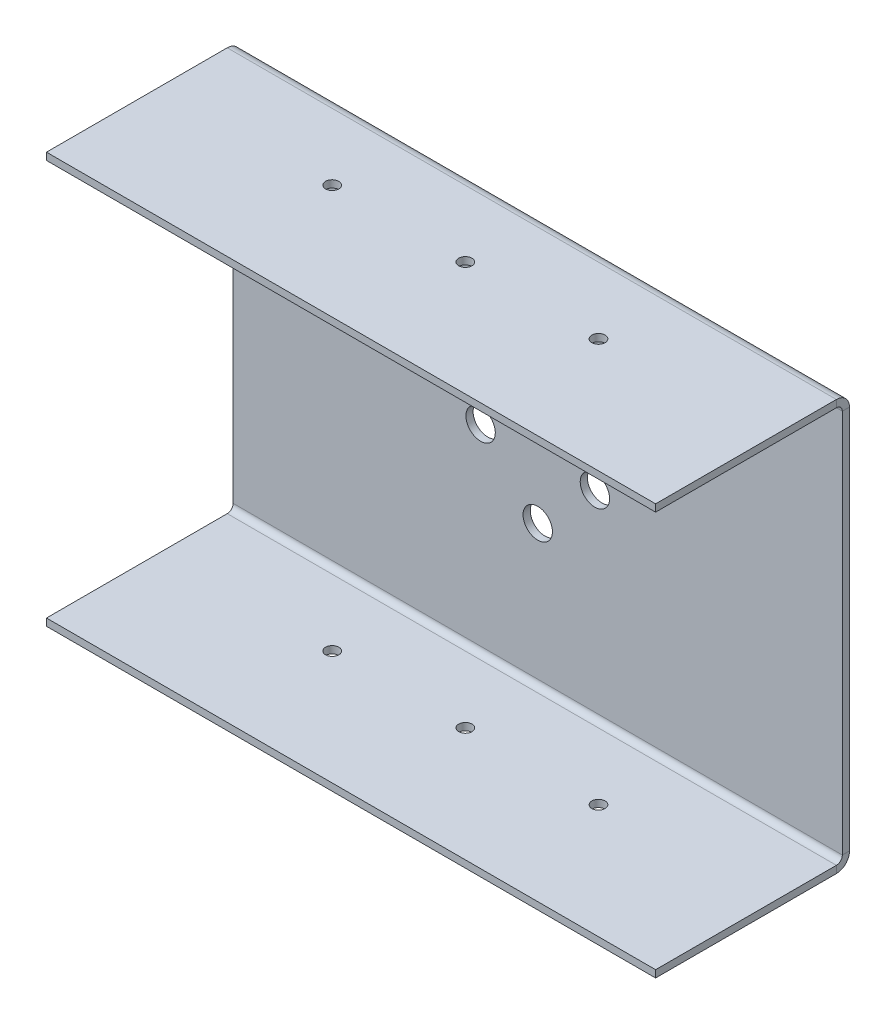
ISO-10303-21;
HEADER;
FILE_DESCRIPTION(('STEP AP214'),'2;1');
FILE_NAME('part.step','',(''),(''),'','','');
FILE_SCHEMA(('AUTOMOTIVE_DESIGN { 1 0 10303 214 1 1 1 1 }'));
ENDSEC;
DATA;
#1=APPLICATION_CONTEXT('core data for automotive mechanical design processes');
#2=APPLICATION_PROTOCOL_DEFINITION('international standard','automotive_design',2000,#1);
#3=PRODUCT_CONTEXT('',#1,'mechanical');
#4=PRODUCT('Part','Part','',(#3));
#5=PRODUCT_RELATED_PRODUCT_CATEGORY('part','',(#4));
#6=PRODUCT_DEFINITION_FORMATION('','',#4);
#7=PRODUCT_DEFINITION_CONTEXT('part definition',#1,'design');
#8=PRODUCT_DEFINITION('design','',#6,#7);
#9=PRODUCT_DEFINITION_SHAPE('','',#8);
#10=(LENGTH_UNIT() NAMED_UNIT(*) SI_UNIT(.MILLI.,.METRE.));
#11=(NAMED_UNIT(*) PLANE_ANGLE_UNIT() SI_UNIT($,.RADIAN.));
#12=(NAMED_UNIT(*) SI_UNIT($,.STERADIAN.) SOLID_ANGLE_UNIT());
#13=UNCERTAINTY_MEASURE_WITH_UNIT(LENGTH_MEASURE(1.E-05),#10,'distance_accuracy_value','');
#14=(GEOMETRIC_REPRESENTATION_CONTEXT(3) GLOBAL_UNCERTAINTY_ASSIGNED_CONTEXT((#13)) GLOBAL_UNIT_ASSIGNED_CONTEXT((#10,
#11,#12)) REPRESENTATION_CONTEXT('',''));
#15=CARTESIAN_POINT('',(0.,0.,0.));
#16=DIRECTION('',(0.,0.,1.));
#17=DIRECTION('',(1.,0.,0.));
#18=AXIS2_PLACEMENT_3D('',#15,#16,#17);
#19=CARTESIAN_POINT('',(0.,130.050592566536,128.939207433465));
#20=DIRECTION('',(0.,0.,1.));
#21=DIRECTION('',(0.,-1.,0.));
#22=AXIS2_PLACEMENT_3D('',#19,#20,#21);
#23=PLANE('',#22);
#24=CARTESIAN_POINT('',(67.69,56.7330925665358,128.939207433464));
#25=DIRECTION('',(0.,0.,1.));
#26=DIRECTION('',(0.,-1.,0.));
#27=AXIS2_PLACEMENT_3D('',#24,#25,#26);
#28=CIRCLE('',#27,3.26389999999998);
#29=CARTESIAN_POINT('',(67.69,53.4691925665359,128.939207433464));
#30=VERTEX_POINT('',#29);
#31=EDGE_CURVE('E329',#30,#30,#28,.T.);
#32=ORIENTED_EDGE('',*,*,#31,.T.);
#33=EDGE_LOOP('',(#32));
#34=FACE_BOUND('',#33,.T.);
#35=CARTESIAN_POINT('',(67.69,31.3330925665358,128.939207433464));
#36=DIRECTION('',(0.,0.,1.));
#37=DIRECTION('',(0.,-1.,0.));
#38=AXIS2_PLACEMENT_3D('',#35,#36,#37);
#39=CIRCLE('',#38,3.26389999999998);
#40=CARTESIAN_POINT('',(67.69,28.0691925665359,128.939207433464));
#41=VERTEX_POINT('',#40);
#42=EDGE_CURVE('E321',#41,#41,#39,.T.);
#43=ORIENTED_EDGE('',*,*,#42,.T.);
#44=EDGE_LOOP('',(#43));
#45=FACE_BOUND('',#44,.T.);
#46=CARTESIAN_POINT('',(54.99,44.0330925665358,128.939207433464));
#47=DIRECTION('',(0.,0.,1.));
#48=DIRECTION('',(0.,-1.,0.));
#49=AXIS2_PLACEMENT_3D('',#46,#47,#48);
#50=CIRCLE('',#49,3.26389999999999);
#51=CARTESIAN_POINT('',(54.99,40.7691925665359,128.939207433464));
#52=VERTEX_POINT('',#51);
#53=EDGE_CURVE('E313',#52,#52,#50,.T.);
#54=ORIENTED_EDGE('',*,*,#53,.T.);
#55=EDGE_LOOP('',(#54));
#56=FACE_BOUND('',#55,.T.);
#57=CARTESIAN_POINT('',(80.39,44.0330925665358,128.939207433464));
#58=DIRECTION('',(0.,0.,1.));
#59=DIRECTION('',(0.,-1.,0.));
#60=AXIS2_PLACEMENT_3D('',#57,#58,#59);
#61=CIRCLE('',#60,3.26389999999999);
#62=CARTESIAN_POINT('',(80.39,40.7691925665358,128.939207433464));
#63=VERTEX_POINT('',#62);
#64=EDGE_CURVE('E305',#63,#63,#61,.T.);
#65=ORIENTED_EDGE('',*,*,#64,.T.);
#66=EDGE_LOOP('',(#65));
#67=FACE_BOUND('',#66,.T.);
#68=DIRECTION('',(0.,1.,0.));
#69=VECTOR('',#68,1.);
#70=CARTESIAN_POINT('',(135.38,130.050592566536,128.939207433465));
#71=LINE('',#70,#69);
#72=CARTESIAN_POINT('',(135.38,1.32080000000001,128.939207433464));
#73=VERTEX_POINT('',#72);
#74=CARTESIAN_POINT('',(135.38,86.7453851330717,128.939207433464));
#75=VERTEX_POINT('',#74);
#76=EDGE_CURVE('E56',#73,#75,#71,.T.);
#77=ORIENTED_EDGE('',*,*,#76,.F.);
#78=DIRECTION('',(-1.,0.,0.));
#79=VECTOR('',#78,1.);
#80=CARTESIAN_POINT('',(0.,1.32080000000001,128.939207433464));
#81=LINE('',#80,#79);
#82=CARTESIAN_POINT('',(0.,1.32080000000002,128.939207433464));
#83=VERTEX_POINT('',#82);
#84=EDGE_CURVE('E170',#73,#83,#81,.T.);
#85=ORIENTED_EDGE('',*,*,#84,.T.);
#86=DIRECTION('',(0.,-1.,0.));
#87=VECTOR('',#86,1.);
#88=CARTESIAN_POINT('',(0.,130.050592566536,128.939207433465));
#89=LINE('',#88,#87);
#90=CARTESIAN_POINT('',(0.,86.7453851330717,128.939207433464));
#91=VERTEX_POINT('',#90);
#92=EDGE_CURVE('E357',#91,#83,#89,.T.);
#93=ORIENTED_EDGE('',*,*,#92,.F.);
#94=DIRECTION('',(-1.,0.,0.));
#95=VECTOR('',#94,1.);
#96=CARTESIAN_POINT('',(0.,86.7453851330717,128.939207433464));
#97=LINE('',#96,#95);
#98=EDGE_CURVE('E336',#75,#91,#97,.T.);
#99=ORIENTED_EDGE('',*,*,#98,.F.);
#100=EDGE_LOOP('',(#77,#85,#93,#99));
#101=FACE_BOUND('',#100,.T.);
#102=ADVANCED_FACE('F52',(#34,#45,#56,#67,#101),#23,.F.);
#103=CARTESIAN_POINT('',(0.,130.050592566536,128.939207433465));
#104=DIRECTION('',(-1.,0.,0.));
#105=DIRECTION('',(0.,-1.,0.));
#106=AXIS2_PLACEMENT_3D('',#103,#104,#105);
#107=PLANE('',#106);
#108=DIRECTION('',(0.,0.,-1.));
#109=VECTOR('',#108,1.);
#110=CARTESIAN_POINT('',(0.,1.32080000000001,128.939207433464));
#111=LINE('',#110,#109);
#112=CARTESIAN_POINT('',(0.,1.32080000000001,130.539407433464));
#113=VERTEX_POINT('',#112);
#114=EDGE_CURVE('E12',#113,#83,#111,.T.);
#115=ORIENTED_EDGE('',*,*,#114,.F.);
#116=DIRECTION('',(0.,-1.,0.));
#117=VECTOR('',#116,1.);
#118=CARTESIAN_POINT('',(0.,130.050592566536,130.539407433465));
#119=LINE('',#118,#117);
#120=CARTESIAN_POINT('',(0.,86.7453851330717,130.539407433464));
#121=VERTEX_POINT('',#120);
#122=EDGE_CURVE('E70',#121,#113,#119,.T.);
#123=ORIENTED_EDGE('',*,*,#122,.F.);
#124=DIRECTION('',(0.,0.,-1.));
#125=VECTOR('',#124,1.);
#126=CARTESIAN_POINT('',(0.,86.7453851330717,128.939207433464));
#127=LINE('',#126,#125);
#128=EDGE_CURVE('E339',#121,#91,#127,.T.);
#129=ORIENTED_EDGE('',*,*,#128,.T.);
#130=ORIENTED_EDGE('',*,*,#92,.T.);
#131=EDGE_LOOP('',(#115,#123,#129,#130));
#132=FACE_BOUND('',#131,.T.);
#133=ADVANCED_FACE('F54',(#132),#107,.T.);
#134=CARTESIAN_POINT('',(135.38,130.050592566536,128.939207433465));
#135=DIRECTION('',(1.,0.,0.));
#136=DIRECTION('',(0.,1.,0.));
#137=AXIS2_PLACEMENT_3D('',#134,#135,#136);
#138=PLANE('',#137);
#139=DIRECTION('',(0.,0.,1.));
#140=VECTOR('',#139,1.);
#141=CARTESIAN_POINT('',(135.38,1.32080000000001,128.939207433464));
#142=LINE('',#141,#140);
#143=CARTESIAN_POINT('',(135.38,1.32080000000001,130.539407433464));
#144=VERTEX_POINT('',#143);
#145=EDGE_CURVE('E351',#73,#144,#142,.T.);
#146=ORIENTED_EDGE('',*,*,#145,.F.);
#147=ORIENTED_EDGE('',*,*,#76,.T.);
#148=DIRECTION('',(0.,0.,1.));
#149=VECTOR('',#148,1.);
#150=CARTESIAN_POINT('',(135.38,86.7453851330717,128.939207433464));
#151=LINE('',#150,#149);
#152=CARTESIAN_POINT('',(135.38,86.7453851330717,130.539407433464));
#153=VERTEX_POINT('',#152);
#154=EDGE_CURVE('E346',#75,#153,#151,.T.);
#155=ORIENTED_EDGE('',*,*,#154,.T.);
#156=DIRECTION('',(0.,1.,0.));
#157=VECTOR('',#156,1.);
#158=CARTESIAN_POINT('',(135.38,130.050592566536,130.539407433465));
#159=LINE('',#158,#157);
#160=EDGE_CURVE('E78',#144,#153,#159,.T.);
#161=ORIENTED_EDGE('',*,*,#160,.F.);
#162=EDGE_LOOP('',(#146,#147,#155,#161));
#163=FACE_BOUND('',#162,.T.);
#164=ADVANCED_FACE('F366',(#163),#138,.T.);
#165=CARTESIAN_POINT('',(0.,130.050592566536,130.539407433465));
#166=DIRECTION('',(0.,0.,1.));
#167=DIRECTION('',(0.,-1.,0.));
#168=AXIS2_PLACEMENT_3D('',#165,#166,#167);
#169=PLANE('',#168);
#170=DIRECTION('',(-1.,0.,0.));
#171=VECTOR('',#170,1.);
#172=CARTESIAN_POINT('',(0.,1.32080000000001,130.539407433464));
#173=LINE('',#172,#171);
#174=EDGE_CURVE('E62',#144,#113,#173,.T.);
#175=ORIENTED_EDGE('',*,*,#174,.F.);
#176=ORIENTED_EDGE('',*,*,#160,.T.);
#177=DIRECTION('',(-1.,0.,0.));
#178=VECTOR('',#177,1.);
#179=CARTESIAN_POINT('',(0.,86.7453851330717,130.539407433464));
#180=LINE('',#179,#178);
#181=EDGE_CURVE('E343',#153,#121,#180,.T.);
#182=ORIENTED_EDGE('',*,*,#181,.T.);
#183=ORIENTED_EDGE('',*,*,#122,.T.);
#184=EDGE_LOOP('',(#175,#176,#182,#183));
#185=FACE_BOUND('',#184,.T.);
#186=CARTESIAN_POINT('',(67.69,56.7330925665358,130.539407433464));
#187=DIRECTION('',(0.,0.,1.));
#188=DIRECTION('',(0.,-1.,0.));
#189=AXIS2_PLACEMENT_3D('',#186,#187,#188);
#190=CIRCLE('',#189,3.26389999999998);
#191=CARTESIAN_POINT('',(67.69,53.4691925665359,130.539407433464));
#192=VERTEX_POINT('',#191);
#193=EDGE_CURVE('E325',#192,#192,#190,.T.);
#194=ORIENTED_EDGE('',*,*,#193,.F.);
#195=EDGE_LOOP('',(#194));
#196=FACE_BOUND('',#195,.T.);
#197=CARTESIAN_POINT('',(67.69,31.3330925665358,130.539407433464));
#198=DIRECTION('',(0.,0.,1.));
#199=DIRECTION('',(0.,-1.,0.));
#200=AXIS2_PLACEMENT_3D('',#197,#198,#199);
#201=CIRCLE('',#200,3.26389999999998);
#202=CARTESIAN_POINT('',(67.69,28.0691925665359,130.539407433464));
#203=VERTEX_POINT('',#202);
#204=EDGE_CURVE('E317',#203,#203,#201,.T.);
#205=ORIENTED_EDGE('',*,*,#204,.F.);
#206=EDGE_LOOP('',(#205));
#207=FACE_BOUND('',#206,.T.);
#208=CARTESIAN_POINT('',(54.99,44.0330925665358,130.539407433464));
#209=DIRECTION('',(0.,0.,1.));
#210=DIRECTION('',(0.,-1.,0.));
#211=AXIS2_PLACEMENT_3D('',#208,#209,#210);
#212=CIRCLE('',#211,3.26389999999999);
#213=CARTESIAN_POINT('',(54.99,40.7691925665359,130.539407433464));
#214=VERTEX_POINT('',#213);
#215=EDGE_CURVE('E309',#214,#214,#212,.T.);
#216=ORIENTED_EDGE('',*,*,#215,.F.);
#217=EDGE_LOOP('',(#216));
#218=FACE_BOUND('',#217,.T.);
#219=CARTESIAN_POINT('',(80.39,44.0330925665358,130.539407433464));
#220=DIRECTION('',(0.,0.,1.));
#221=DIRECTION('',(0.,-1.,0.));
#222=AXIS2_PLACEMENT_3D('',#219,#220,#221);
#223=CIRCLE('',#222,3.26389999999999);
#224=CARTESIAN_POINT('',(80.39,40.7691925665358,130.539407433464));
#225=VERTEX_POINT('',#224);
#226=EDGE_CURVE('E299',#225,#225,#223,.T.);
#227=ORIENTED_EDGE('',*,*,#226,.F.);
#228=EDGE_LOOP('',(#227));
#229=FACE_BOUND('',#228,.T.);
#230=ADVANCED_FACE('F362',(#185,#196,#207,#218,#229),#169,.T.);
#231=CARTESIAN_POINT('',(67.69,56.7330925665358,128.939207433464));
#232=DIRECTION('',(0.,0.,1.));
#233=DIRECTION('',(0.,-1.,0.));
#234=AXIS2_PLACEMENT_3D('',#231,#232,#233);
#235=CYLINDRICAL_SURFACE('',#234,3.26389999999998);
#236=ORIENTED_EDGE('',*,*,#31,.F.);
#237=EDGE_LOOP('',(#236));
#238=FACE_BOUND('',#237,.T.);
#239=ORIENTED_EDGE('',*,*,#193,.T.);
#240=EDGE_LOOP('',(#239));
#241=FACE_BOUND('',#240,.T.);
#242=ADVANCED_FACE('F459',(#238,#241),#235,.F.);
#243=CARTESIAN_POINT('',(67.69,31.3330925665358,128.939207433464));
#244=DIRECTION('',(0.,0.,1.));
#245=DIRECTION('',(0.,-1.,0.));
#246=AXIS2_PLACEMENT_3D('',#243,#244,#245);
#247=CYLINDRICAL_SURFACE('',#246,3.26389999999998);
#248=ORIENTED_EDGE('',*,*,#42,.F.);
#249=EDGE_LOOP('',(#248));
#250=FACE_BOUND('',#249,.T.);
#251=ORIENTED_EDGE('',*,*,#204,.T.);
#252=EDGE_LOOP('',(#251));
#253=FACE_BOUND('',#252,.T.);
#254=ADVANCED_FACE('F466',(#250,#253),#247,.F.);
#255=CARTESIAN_POINT('',(54.99,44.0330925665358,128.939207433464));
#256=DIRECTION('',(0.,0.,1.));
#257=DIRECTION('',(0.,-1.,0.));
#258=AXIS2_PLACEMENT_3D('',#255,#256,#257);
#259=CYLINDRICAL_SURFACE('',#258,3.26389999999999);
#260=ORIENTED_EDGE('',*,*,#53,.F.);
#261=EDGE_LOOP('',(#260));
#262=FACE_BOUND('',#261,.T.);
#263=ORIENTED_EDGE('',*,*,#215,.T.);
#264=EDGE_LOOP('',(#263));
#265=FACE_BOUND('',#264,.T.);
#266=ADVANCED_FACE('F471',(#262,#265),#259,.F.);
#267=CARTESIAN_POINT('',(80.39,44.0330925665358,128.939207433464));
#268=DIRECTION('',(0.,0.,1.));
#269=DIRECTION('',(0.,-1.,0.));
#270=AXIS2_PLACEMENT_3D('',#267,#268,#269);
#271=CYLINDRICAL_SURFACE('',#270,3.26389999999999);
#272=ORIENTED_EDGE('',*,*,#64,.F.);
#273=EDGE_LOOP('',(#272));
#274=FACE_BOUND('',#273,.T.);
#275=ORIENTED_EDGE('',*,*,#226,.T.);
#276=EDGE_LOOP('',(#275));
#277=FACE_BOUND('',#276,.T.);
#278=ADVANCED_FACE('F483',(#274,#277),#271,.F.);
#279=CARTESIAN_POINT('',(135.38,86.7453851330717,131.860207433464));
#280=DIRECTION('',(1.,0.,0.));
#281=DIRECTION('',(0.,1.,0.));
#282=AXIS2_PLACEMENT_3D('',#279,#280,#281);
#283=PLANE('',#282);
#284=DIRECTION('',(0.,-1.,0.));
#285=VECTOR('',#284,1.);
#286=CARTESIAN_POINT('',(135.38,89.6663851330717,131.860207433464));
#287=LINE('',#286,#285);
#288=CARTESIAN_POINT('',(135.38,89.6663851330717,131.860207433464));
#289=VERTEX_POINT('',#288);
#290=CARTESIAN_POINT('',(135.38,88.0661851330717,131.860207433464));
#291=VERTEX_POINT('',#290);
#292=EDGE_CURVE('E285',#289,#291,#287,.T.);
#293=ORIENTED_EDGE('',*,*,#292,.T.);
#294=CARTESIAN_POINT('',(135.38,86.7453851330717,131.860207433464));
#295=DIRECTION('',(1.,0.,0.));
#296=DIRECTION('',(0.,1.,0.));
#297=AXIS2_PLACEMENT_3D('',#294,#295,#296);
#298=CIRCLE('',#297,1.3208);
#299=EDGE_CURVE('E225',#291,#153,#298,.F.);
#300=ORIENTED_EDGE('',*,*,#299,.T.);
#301=ORIENTED_EDGE('',*,*,#154,.F.);
#302=CARTESIAN_POINT('',(135.38,86.7453851330717,131.860207433464));
#303=DIRECTION('',(-1.,0.,0.));
#304=DIRECTION('',(0.,1.,0.));
#305=AXIS2_PLACEMENT_3D('',#302,#303,#304);
#306=CIRCLE('',#305,2.921);
#307=EDGE_CURVE('E290',#289,#75,#306,.T.);
#308=ORIENTED_EDGE('',*,*,#307,.F.);
#309=EDGE_LOOP('',(#293,#300,#301,#308));
#310=FACE_BOUND('',#309,.T.);
#311=ADVANCED_FACE('F370',(#310),#283,.T.);
#312=CARTESIAN_POINT('',(0.,86.7453851330717,131.860207433464));
#313=DIRECTION('',(-1.,0.,0.));
#314=DIRECTION('',(0.,-1.,0.));
#315=AXIS2_PLACEMENT_3D('',#312,#313,#314);
#316=PLANE('',#315);
#317=ORIENTED_EDGE('',*,*,#128,.F.);
#318=CARTESIAN_POINT('',(0.,86.7453851330717,131.860207433464));
#319=DIRECTION('',(1.,0.,0.));
#320=DIRECTION('',(0.,1.,0.));
#321=AXIS2_PLACEMENT_3D('',#318,#319,#320);
#322=CIRCLE('',#321,1.3208);
#323=CARTESIAN_POINT('',(0.,88.0661851330717,131.860207433464));
#324=VERTEX_POINT('',#323);
#325=EDGE_CURVE('E295',#121,#324,#322,.T.);
#326=ORIENTED_EDGE('',*,*,#325,.T.);
#327=DIRECTION('',(0.,1.,0.));
#328=VECTOR('',#327,1.);
#329=CARTESIAN_POINT('',(0.,89.6663851330717,131.860207433464));
#330=LINE('',#329,#328);
#331=CARTESIAN_POINT('',(0.,89.6663851330717,131.860207433464));
#332=VERTEX_POINT('',#331);
#333=EDGE_CURVE('E277',#324,#332,#330,.T.);
#334=ORIENTED_EDGE('',*,*,#333,.T.);
#335=CARTESIAN_POINT('',(0.,86.7453851330717,131.860207433464));
#336=DIRECTION('',(1.,0.,0.));
#337=DIRECTION('',(0.,-1.,0.));
#338=AXIS2_PLACEMENT_3D('',#335,#336,#337);
#339=CIRCLE('',#338,2.921);
#340=EDGE_CURVE('E294',#91,#332,#339,.T.);
#341=ORIENTED_EDGE('',*,*,#340,.F.);
#342=EDGE_LOOP('',(#317,#326,#334,#341));
#343=FACE_BOUND('',#342,.T.);
#344=ADVANCED_FACE('F383',(#343),#316,.T.);
#345=CARTESIAN_POINT('',(-67.7356420966099,86.7453851330717,131.860207433464));
#346=DIRECTION('',(1.,0.,0.));
#347=DIRECTION('',(0.,1.,0.));
#348=AXIS2_PLACEMENT_3D('',#345,#346,#347);
#349=CYLINDRICAL_SURFACE('',#348,2.921);
#350=ORIENTED_EDGE('',*,*,#340,.T.);
#351=DIRECTION('',(-1.,0.,0.));
#352=VECTOR('',#351,1.);
#353=CARTESIAN_POINT('',(0.,89.6663851330717,131.860207433464));
#354=LINE('',#353,#352);
#355=EDGE_CURVE('E242',#289,#332,#354,.T.);
#356=ORIENTED_EDGE('',*,*,#355,.F.);
#357=ORIENTED_EDGE('',*,*,#307,.T.);
#358=ORIENTED_EDGE('',*,*,#98,.T.);
#359=EDGE_LOOP('',(#350,#356,#357,#358));
#360=FACE_BOUND('',#359,.T.);
#361=ADVANCED_FACE('F374',(#360),#349,.T.);
#362=CARTESIAN_POINT('',(-67.7356420966099,86.7453851330717,131.860207433464));
#363=DIRECTION('',(1.,0.,0.));
#364=DIRECTION('',(0.,1.,0.));
#365=AXIS2_PLACEMENT_3D('',#362,#363,#364);
#366=CYLINDRICAL_SURFACE('',#365,1.3208);
#367=ORIENTED_EDGE('',*,*,#325,.F.);
#368=ORIENTED_EDGE('',*,*,#181,.F.);
#369=ORIENTED_EDGE('',*,*,#299,.F.);
#370=DIRECTION('',(-1.,0.,0.));
#371=VECTOR('',#370,1.);
#372=CARTESIAN_POINT('',(0.,88.0661851330717,131.860207433464));
#373=LINE('',#372,#371);
#374=EDGE_CURVE('E281',#291,#324,#373,.T.);
#375=ORIENTED_EDGE('',*,*,#374,.T.);
#376=EDGE_LOOP('',(#367,#368,#369,#375));
#377=FACE_BOUND('',#376,.T.);
#378=ADVANCED_FACE('F397',(#377),#366,.F.);
#379=CARTESIAN_POINT('',(0.,89.6663851330714,172.035));
#380=DIRECTION('',(0.,0.,1.));
#381=DIRECTION('',(-1.,0.,0.));
#382=AXIS2_PLACEMENT_3D('',#379,#380,#381);
#383=PLANE('',#382);
#384=DIRECTION('',(-1.,0.,0.));
#385=VECTOR('',#384,1.);
#386=CARTESIAN_POINT('',(0.,88.0661851330714,172.035));
#387=LINE('',#386,#385);
#388=CARTESIAN_POINT('',(135.38,88.0661851330714,172.035));
#389=VERTEX_POINT('',#388);
#390=CARTESIAN_POINT('',(0.,88.0661851330714,172.035));
#391=VERTEX_POINT('',#390);
#392=EDGE_CURVE('E232',#389,#391,#387,.T.);
#393=ORIENTED_EDGE('',*,*,#392,.F.);
#394=DIRECTION('',(0.,-1.,0.));
#395=VECTOR('',#394,1.);
#396=CARTESIAN_POINT('',(135.38,89.6663851330714,172.035));
#397=LINE('',#396,#395);
#398=CARTESIAN_POINT('',(135.38,89.6663851330714,172.035));
#399=VERTEX_POINT('',#398);
#400=EDGE_CURVE('E221',#399,#389,#397,.T.);
#401=ORIENTED_EDGE('',*,*,#400,.F.);
#402=DIRECTION('',(-1.,0.,0.));
#403=VECTOR('',#402,1.);
#404=CARTESIAN_POINT('',(0.,89.6663851330714,172.035));
#405=LINE('',#404,#403);
#406=CARTESIAN_POINT('',(0.,89.6663851330714,172.035));
#407=VERTEX_POINT('',#406);
#408=EDGE_CURVE('E273',#399,#407,#405,.T.);
#409=ORIENTED_EDGE('',*,*,#408,.T.);
#410=DIRECTION('',(0.,-1.,0.));
#411=VECTOR('',#410,1.);
#412=CARTESIAN_POINT('',(0.,89.6663851330714,172.035));
#413=LINE('',#412,#411);
#414=EDGE_CURVE('E270',#407,#391,#413,.T.);
#415=ORIENTED_EDGE('',*,*,#414,.T.);
#416=EDGE_LOOP('',(#393,#401,#409,#415));
#417=FACE_BOUND('',#416,.T.);
#418=ADVANCED_FACE('F391',(#417),#383,.T.);
#419=CARTESIAN_POINT('',(67.69,89.6663851330716,146.635));
#420=DIRECTION('',(0.,-1.,0.));
#421=DIRECTION('',(0.,0.,-1.));
#422=AXIS2_PLACEMENT_3D('',#419,#420,#421);
#423=CYLINDRICAL_SURFACE('',#422,1.4732);
#424=CARTESIAN_POINT('',(67.69,89.6663851330716,146.635));
#425=DIRECTION('',(0.,-1.,0.));
#426=DIRECTION('',(0.,0.,-1.));
#427=AXIS2_PLACEMENT_3D('',#424,#425,#426);
#428=CIRCLE('',#427,1.4732);
#429=CARTESIAN_POINT('',(67.69,89.6663851330716,145.1618));
#430=VERTEX_POINT('',#429);
#431=EDGE_CURVE('E246',#430,#430,#428,.T.);
#432=ORIENTED_EDGE('',*,*,#431,.F.);
#433=EDGE_LOOP('',(#432));
#434=FACE_BOUND('',#433,.T.);
#435=CARTESIAN_POINT('',(67.69,88.0661851330716,146.635));
#436=DIRECTION('',(0.,-1.,0.));
#437=DIRECTION('',(0.,0.,-1.));
#438=AXIS2_PLACEMENT_3D('',#435,#436,#437);
#439=CIRCLE('',#438,1.4732);
#440=CARTESIAN_POINT('',(67.69,88.0661851330716,145.1618));
#441=VERTEX_POINT('',#440);
#442=EDGE_CURVE('E266',#441,#441,#439,.T.);
#443=ORIENTED_EDGE('',*,*,#442,.T.);
#444=EDGE_LOOP('',(#443));
#445=FACE_BOUND('',#444,.T.);
#446=ADVANCED_FACE('F521',(#434,#445),#423,.F.);
#447=CARTESIAN_POINT('',(97.28,89.6663851330716,146.635));
#448=DIRECTION('',(0.,-1.,0.));
#449=DIRECTION('',(0.,0.,-1.));
#450=AXIS2_PLACEMENT_3D('',#447,#448,#449);
#451=CYLINDRICAL_SURFACE('',#450,1.4732);
#452=CARTESIAN_POINT('',(97.28,89.6663851330716,146.635));
#453=DIRECTION('',(0.,-1.,0.));
#454=DIRECTION('',(0.,0.,-1.));
#455=AXIS2_PLACEMENT_3D('',#452,#453,#454);
#456=CIRCLE('',#455,1.4732);
#457=CARTESIAN_POINT('',(97.28,89.6663851330716,145.1618));
#458=VERTEX_POINT('',#457);
#459=EDGE_CURVE('E250',#458,#458,#456,.T.);
#460=ORIENTED_EDGE('',*,*,#459,.F.);
#461=EDGE_LOOP('',(#460));
#462=FACE_BOUND('',#461,.T.);
#463=CARTESIAN_POINT('',(97.28,88.0661851330716,146.635));
#464=DIRECTION('',(0.,-1.,0.));
#465=DIRECTION('',(0.,0.,-1.));
#466=AXIS2_PLACEMENT_3D('',#463,#464,#465);
#467=CIRCLE('',#466,1.4732);
#468=CARTESIAN_POINT('',(97.28,88.0661851330716,145.1618));
#469=VERTEX_POINT('',#468);
#470=EDGE_CURVE('E262',#469,#469,#467,.T.);
#471=ORIENTED_EDGE('',*,*,#470,.T.);
#472=EDGE_LOOP('',(#471));
#473=FACE_BOUND('',#472,.T.);
#474=ADVANCED_FACE('F517',(#462,#473),#451,.F.);
#475=CARTESIAN_POINT('',(38.1,89.6663851330716,146.635));
#476=DIRECTION('',(0.,-1.,0.));
#477=DIRECTION('',(0.,0.,-1.));
#478=AXIS2_PLACEMENT_3D('',#475,#476,#477);
#479=CYLINDRICAL_SURFACE('',#478,1.4732);
#480=CARTESIAN_POINT('',(38.1,89.6663851330716,146.635));
#481=DIRECTION('',(0.,-1.,0.));
#482=DIRECTION('',(0.,0.,-1.));
#483=AXIS2_PLACEMENT_3D('',#480,#481,#482);
#484=CIRCLE('',#483,1.4732);
#485=CARTESIAN_POINT('',(38.1,89.6663851330716,145.1618));
#486=VERTEX_POINT('',#485);
#487=EDGE_CURVE('E254',#486,#486,#484,.T.);
#488=ORIENTED_EDGE('',*,*,#487,.F.);
#489=EDGE_LOOP('',(#488));
#490=FACE_BOUND('',#489,.T.);
#491=CARTESIAN_POINT('',(38.1,88.0661851330716,146.635));
#492=DIRECTION('',(0.,-1.,0.));
#493=DIRECTION('',(0.,0.,-1.));
#494=AXIS2_PLACEMENT_3D('',#491,#492,#493);
#495=CIRCLE('',#494,1.4732);
#496=CARTESIAN_POINT('',(38.1,88.0661851330716,145.1618));
#497=VERTEX_POINT('',#496);
#498=EDGE_CURVE('E258',#497,#497,#495,.T.);
#499=ORIENTED_EDGE('',*,*,#498,.T.);
#500=EDGE_LOOP('',(#499));
#501=FACE_BOUND('',#500,.T.);
#502=ADVANCED_FACE('F513',(#490,#501),#479,.F.);
#503=CARTESIAN_POINT('',(0.,89.6663851330714,172.035));
#504=DIRECTION('',(0.,-1.,0.));
#505=DIRECTION('',(0.,0.,-1.));
#506=AXIS2_PLACEMENT_3D('',#503,#504,#505);
#507=PLANE('',#506);
#508=ORIENTED_EDGE('',*,*,#487,.T.);
#509=EDGE_LOOP('',(#508));
#510=FACE_BOUND('',#509,.T.);
#511=ORIENTED_EDGE('',*,*,#459,.T.);
#512=EDGE_LOOP('',(#511));
#513=FACE_BOUND('',#512,.T.);
#514=ORIENTED_EDGE('',*,*,#431,.T.);
#515=EDGE_LOOP('',(#514));
#516=FACE_BOUND('',#515,.T.);
#517=DIRECTION('',(0.,0.,1.));
#518=VECTOR('',#517,1.);
#519=CARTESIAN_POINT('',(135.38,89.6663851330714,172.035));
#520=LINE('',#519,#518);
#521=EDGE_CURVE('E226',#289,#399,#520,.T.);
#522=ORIENTED_EDGE('',*,*,#521,.F.);
#523=ORIENTED_EDGE('',*,*,#355,.T.);
#524=DIRECTION('',(0.,0.,-1.));
#525=VECTOR('',#524,1.);
#526=CARTESIAN_POINT('',(0.,89.6663851330714,172.035));
#527=LINE('',#526,#525);
#528=EDGE_CURVE('E239',#407,#332,#527,.T.);
#529=ORIENTED_EDGE('',*,*,#528,.F.);
#530=ORIENTED_EDGE('',*,*,#408,.F.);
#531=EDGE_LOOP('',(#522,#523,#529,#530));
#532=FACE_BOUND('',#531,.T.);
#533=ADVANCED_FACE('F378',(#510,#513,#516,#532),#507,.F.);
#534=CARTESIAN_POINT('',(0.,89.6663851330714,172.035));
#535=DIRECTION('',(-1.,0.,0.));
#536=DIRECTION('',(0.,0.,-1.));
#537=AXIS2_PLACEMENT_3D('',#534,#535,#536);
#538=PLANE('',#537);
#539=ORIENTED_EDGE('',*,*,#333,.F.);
#540=DIRECTION('',(0.,0.,-1.));
#541=VECTOR('',#540,1.);
#542=CARTESIAN_POINT('',(0.,88.0661851330714,172.035));
#543=LINE('',#542,#541);
#544=EDGE_CURVE('E229',#391,#324,#543,.T.);
#545=ORIENTED_EDGE('',*,*,#544,.F.);
#546=ORIENTED_EDGE('',*,*,#414,.F.);
#547=ORIENTED_EDGE('',*,*,#528,.T.);
#548=EDGE_LOOP('',(#539,#545,#546,#547));
#549=FACE_BOUND('',#548,.T.);
#550=ADVANCED_FACE('F388',(#549),#538,.T.);
#551=CARTESIAN_POINT('',(0.,88.0661851330714,172.035));
#552=DIRECTION('',(0.,-1.,0.));
#553=DIRECTION('',(0.,0.,-1.));
#554=AXIS2_PLACEMENT_3D('',#551,#552,#553);
#555=PLANE('',#554);
#556=ORIENTED_EDGE('',*,*,#374,.F.);
#557=DIRECTION('',(0.,0.,1.));
#558=VECTOR('',#557,1.);
#559=CARTESIAN_POINT('',(135.38,88.0661851330714,172.035));
#560=LINE('',#559,#558);
#561=EDGE_CURVE('E236',#291,#389,#560,.T.);
#562=ORIENTED_EDGE('',*,*,#561,.T.);
#563=ORIENTED_EDGE('',*,*,#392,.T.);
#564=ORIENTED_EDGE('',*,*,#544,.T.);
#565=EDGE_LOOP('',(#556,#562,#563,#564));
#566=FACE_BOUND('',#565,.T.);
#567=ORIENTED_EDGE('',*,*,#442,.F.);
#568=EDGE_LOOP('',(#567));
#569=FACE_BOUND('',#568,.T.);
#570=ORIENTED_EDGE('',*,*,#470,.F.);
#571=EDGE_LOOP('',(#570));
#572=FACE_BOUND('',#571,.T.);
#573=ORIENTED_EDGE('',*,*,#498,.F.);
#574=EDGE_LOOP('',(#573));
#575=FACE_BOUND('',#574,.T.);
#576=ADVANCED_FACE('F505',(#566,#569,#572,#575),#555,.T.);
#577=CARTESIAN_POINT('',(135.38,89.6663851330714,172.035));
#578=DIRECTION('',(1.,0.,0.));
#579=DIRECTION('',(0.,0.,1.));
#580=AXIS2_PLACEMENT_3D('',#577,#578,#579);
#581=PLANE('',#580);
#582=ORIENTED_EDGE('',*,*,#292,.F.);
#583=ORIENTED_EDGE('',*,*,#521,.T.);
#584=ORIENTED_EDGE('',*,*,#400,.T.);
#585=ORIENTED_EDGE('',*,*,#561,.F.);
#586=EDGE_LOOP('',(#582,#583,#584,#585));
#587=FACE_BOUND('',#586,.T.);
#588=ADVANCED_FACE('F394',(#587),#581,.T.);
#589=CARTESIAN_POINT('',(97.28,-1.6002,146.635));
#590=DIRECTION('',(0.,1.,0.));
#591=DIRECTION('',(0.,0.,1.));
#592=AXIS2_PLACEMENT_3D('',#589,#590,#591);
#593=CYLINDRICAL_SURFACE('',#592,1.4732);
#594=CARTESIAN_POINT('',(97.28,-1.6002,146.635));
#595=DIRECTION('',(0.,1.,0.));
#596=DIRECTION('',(0.,0.,-1.));
#597=AXIS2_PLACEMENT_3D('',#594,#595,#596);
#598=CIRCLE('',#597,1.4732);
#599=CARTESIAN_POINT('',(97.28,-1.6002,145.1618));
#600=VERTEX_POINT('',#599);
#601=EDGE_CURVE('E190',#600,#600,#598,.T.);
#602=ORIENTED_EDGE('',*,*,#601,.F.);
#603=EDGE_LOOP('',(#602));
#604=FACE_BOUND('',#603,.T.);
#605=CARTESIAN_POINT('',(97.28,0.,146.635));
#606=DIRECTION('',(0.,1.,0.));
#607=DIRECTION('',(0.,0.,-1.));
#608=AXIS2_PLACEMENT_3D('',#605,#606,#607);
#609=CIRCLE('',#608,1.4732);
#610=CARTESIAN_POINT('',(97.28,0.,145.1618));
#611=VERTEX_POINT('',#610);
#612=EDGE_CURVE('E185',#611,#611,#609,.T.);
#613=ORIENTED_EDGE('',*,*,#612,.T.);
#614=EDGE_LOOP('',(#613));
#615=FACE_BOUND('',#614,.T.);
#616=ADVANCED_FACE('F504',(#604,#615),#593,.F.);
#617=CARTESIAN_POINT('',(38.1,-1.6002,146.635));
#618=DIRECTION('',(0.,1.,0.));
#619=DIRECTION('',(0.,0.,1.));
#620=AXIS2_PLACEMENT_3D('',#617,#618,#619);
#621=CYLINDRICAL_SURFACE('',#620,1.4732);
#622=CARTESIAN_POINT('',(38.1,-1.6002,146.635));
#623=DIRECTION('',(0.,1.,0.));
#624=DIRECTION('',(0.,0.,-1.));
#625=AXIS2_PLACEMENT_3D('',#622,#623,#624);
#626=CIRCLE('',#625,1.4732);
#627=CARTESIAN_POINT('',(38.1,-1.6002,145.1618));
#628=VERTEX_POINT('',#627);
#629=EDGE_CURVE('E194',#628,#628,#626,.T.);
#630=ORIENTED_EDGE('',*,*,#629,.F.);
#631=EDGE_LOOP('',(#630));
#632=FACE_BOUND('',#631,.T.);
#633=CARTESIAN_POINT('',(38.1,0.,146.635));
#634=DIRECTION('',(0.,1.,0.));
#635=DIRECTION('',(0.,0.,-1.));
#636=AXIS2_PLACEMENT_3D('',#633,#634,#635);
#637=CIRCLE('',#636,1.4732);
#638=CARTESIAN_POINT('',(38.1,0.,145.1618));
#639=VERTEX_POINT('',#638);
#640=EDGE_CURVE('E214',#639,#639,#637,.T.);
#641=ORIENTED_EDGE('',*,*,#640,.T.);
#642=EDGE_LOOP('',(#641));
#643=FACE_BOUND('',#642,.T.);
#644=ADVANCED_FACE('F564',(#632,#643),#621,.F.);
#645=CARTESIAN_POINT('',(67.69,-1.6002,146.635));
#646=DIRECTION('',(0.,1.,0.));
#647=DIRECTION('',(0.,0.,1.));
#648=AXIS2_PLACEMENT_3D('',#645,#646,#647);
#649=CYLINDRICAL_SURFACE('',#648,1.4732);
#650=CARTESIAN_POINT('',(67.69,-1.6002,146.635));
#651=DIRECTION('',(0.,1.,0.));
#652=DIRECTION('',(0.,0.,1.));
#653=AXIS2_PLACEMENT_3D('',#650,#651,#652);
#654=CIRCLE('',#653,1.4732);
#655=CARTESIAN_POINT('',(67.69,-1.6002,148.1082));
#656=VERTEX_POINT('',#655);
#657=EDGE_CURVE('E201',#656,#656,#654,.T.);
#658=ORIENTED_EDGE('',*,*,#657,.F.);
#659=EDGE_LOOP('',(#658));
#660=FACE_BOUND('',#659,.T.);
#661=CARTESIAN_POINT('',(67.69,0.,146.635));
#662=DIRECTION('',(0.,1.,0.));
#663=DIRECTION('',(0.,0.,1.));
#664=AXIS2_PLACEMENT_3D('',#661,#662,#663);
#665=CIRCLE('',#664,1.4732);
#666=CARTESIAN_POINT('',(67.69,0.,148.1082));
#667=VERTEX_POINT('',#666);
#668=EDGE_CURVE('E210',#667,#667,#665,.T.);
#669=ORIENTED_EDGE('',*,*,#668,.T.);
#670=EDGE_LOOP('',(#669));
#671=FACE_BOUND('',#670,.T.);
#672=ADVANCED_FACE('F572',(#660,#671),#649,.F.);
#673=CARTESIAN_POINT('',(0.,-1.6002,172.035));
#674=DIRECTION('',(0.,0.,1.));
#675=DIRECTION('',(1.,0.,0.));
#676=AXIS2_PLACEMENT_3D('',#673,#674,#675);
#677=PLANE('',#676);
#678=DIRECTION('',(1.,0.,0.));
#679=VECTOR('',#678,1.);
#680=CARTESIAN_POINT('',(0.,0.,172.035));
#681=LINE('',#680,#679);
#682=CARTESIAN_POINT('',(0.,0.,172.035));
#683=VERTEX_POINT('',#682);
#684=CARTESIAN_POINT('',(135.38,0.,172.035));
#685=VERTEX_POINT('',#684);
#686=EDGE_CURVE('E423',#683,#685,#681,.T.);
#687=ORIENTED_EDGE('',*,*,#686,.F.);
#688=DIRECTION('',(0.,1.,0.));
#689=VECTOR('',#688,1.);
#690=CARTESIAN_POINT('',(0.,-1.6002,172.035));
#691=LINE('',#690,#689);
#692=CARTESIAN_POINT('',(0.,-1.6002,172.035));
#693=VERTEX_POINT('',#692);
#694=EDGE_CURVE('E289',#693,#683,#691,.T.);
#695=ORIENTED_EDGE('',*,*,#694,.F.);
#696=DIRECTION('',(1.,0.,0.));
#697=VECTOR('',#696,1.);
#698=CARTESIAN_POINT('',(0.,-1.6002,172.035));
#699=LINE('',#698,#697);
#700=CARTESIAN_POINT('',(135.38,-1.6002,172.035));
#701=VERTEX_POINT('',#700);
#702=EDGE_CURVE('E207',#693,#701,#699,.T.);
#703=ORIENTED_EDGE('',*,*,#702,.T.);
#704=DIRECTION('',(0.,1.,0.));
#705=VECTOR('',#704,1.);
#706=CARTESIAN_POINT('',(135.38,-1.6002,172.035));
#707=LINE('',#706,#705);
#708=EDGE_CURVE('E188',#701,#685,#707,.T.);
#709=ORIENTED_EDGE('',*,*,#708,.T.);
#710=EDGE_LOOP('',(#687,#695,#703,#709));
#711=FACE_BOUND('',#710,.T.);
#712=ADVANCED_FACE('F437',(#711),#677,.T.);
#713=CARTESIAN_POINT('',(0.,-1.6002,0.));
#714=DIRECTION('',(0.,1.,0.));
#715=DIRECTION('',(0.,0.,1.));
#716=AXIS2_PLACEMENT_3D('',#713,#714,#715);
#717=PLANE('',#716);
#718=DIRECTION('',(-1.,0.,0.));
#719=VECTOR('',#718,1.);
#720=CARTESIAN_POINT('',(0.,-1.6002,131.860207433464));
#721=LINE('',#720,#719);
#722=CARTESIAN_POINT('',(135.38,-1.6002,131.860207433464));
#723=VERTEX_POINT('',#722);
#724=CARTESIAN_POINT('',(0.,-1.6002,131.860207433464));
#725=VERTEX_POINT('',#724);
#726=EDGE_CURVE('E167',#723,#725,#721,.T.);
#727=ORIENTED_EDGE('',*,*,#726,.F.);
#728=DIRECTION('',(0.,0.,-1.));
#729=VECTOR('',#728,1.);
#730=CARTESIAN_POINT('',(135.38,-1.6002,0.));
#731=LINE('',#730,#729);
#732=EDGE_CURVE('E161',#701,#723,#731,.T.);
#733=ORIENTED_EDGE('',*,*,#732,.F.);
#734=ORIENTED_EDGE('',*,*,#702,.F.);
#735=DIRECTION('',(0.,0.,1.));
#736=VECTOR('',#735,1.);
#737=CARTESIAN_POINT('',(0.,-1.6002,0.));
#738=LINE('',#737,#736);
#739=EDGE_CURVE('E182',#725,#693,#738,.T.);
#740=ORIENTED_EDGE('',*,*,#739,.F.);
#741=EDGE_LOOP('',(#727,#733,#734,#740));
#742=FACE_BOUND('',#741,.T.);
#743=ORIENTED_EDGE('',*,*,#657,.T.);
#744=EDGE_LOOP('',(#743));
#745=FACE_BOUND('',#744,.T.);
#746=ORIENTED_EDGE('',*,*,#629,.T.);
#747=EDGE_LOOP('',(#746));
#748=FACE_BOUND('',#747,.T.);
#749=ORIENTED_EDGE('',*,*,#601,.T.);
#750=EDGE_LOOP('',(#749));
#751=FACE_BOUND('',#750,.T.);
#752=ADVANCED_FACE('F178',(#742,#745,#748,#751),#717,.F.);
#753=CARTESIAN_POINT('',(135.38,-1.6002,0.));
#754=DIRECTION('',(1.,0.,0.));
#755=DIRECTION('',(0.,0.,-1.));
#756=AXIS2_PLACEMENT_3D('',#753,#754,#755);
#757=PLANE('',#756);
#758=ORIENTED_EDGE('',*,*,#732,.T.);
#759=DIRECTION('',(0.,1.,0.));
#760=VECTOR('',#759,1.);
#761=CARTESIAN_POINT('',(135.38,-1.60019999999999,131.860207433464));
#762=LINE('',#761,#760);
#763=CARTESIAN_POINT('',(135.38,0.,131.860207433464));
#764=VERTEX_POINT('',#763);
#765=EDGE_CURVE('E147',#723,#764,#762,.T.);
#766=ORIENTED_EDGE('',*,*,#765,.T.);
#767=DIRECTION('',(0.,0.,-1.));
#768=VECTOR('',#767,1.);
#769=CARTESIAN_POINT('',(135.38,0.,0.));
#770=LINE('',#769,#768);
#771=EDGE_CURVE('E160',#685,#764,#770,.T.);
#772=ORIENTED_EDGE('',*,*,#771,.F.);
#773=ORIENTED_EDGE('',*,*,#708,.F.);
#774=EDGE_LOOP('',(#758,#766,#772,#773));
#775=FACE_BOUND('',#774,.T.);
#776=ADVANCED_FACE('F187',(#775),#757,.T.);
#777=CARTESIAN_POINT('',(0.,0.,0.));
#778=DIRECTION('',(0.,1.,0.));
#779=DIRECTION('',(0.,0.,1.));
#780=AXIS2_PLACEMENT_3D('',#777,#778,#779);
#781=PLANE('',#780);
#782=ORIENTED_EDGE('',*,*,#668,.F.);
#783=EDGE_LOOP('',(#782));
#784=FACE_BOUND('',#783,.T.);
#785=ORIENTED_EDGE('',*,*,#640,.F.);
#786=EDGE_LOOP('',(#785));
#787=FACE_BOUND('',#786,.T.);
#788=ORIENTED_EDGE('',*,*,#612,.F.);
#789=EDGE_LOOP('',(#788));
#790=FACE_BOUND('',#789,.T.);
#791=ORIENTED_EDGE('',*,*,#771,.T.);
#792=DIRECTION('',(-1.,0.,0.));
#793=VECTOR('',#792,1.);
#794=CARTESIAN_POINT('',(0.,0.,131.860207433464));
#795=LINE('',#794,#793);
#796=CARTESIAN_POINT('',(0.,0.,131.860207433464));
#797=VERTEX_POINT('',#796);
#798=EDGE_CURVE('E410',#764,#797,#795,.T.);
#799=ORIENTED_EDGE('',*,*,#798,.T.);
#800=DIRECTION('',(0.,0.,1.));
#801=VECTOR('',#800,1.);
#802=CARTESIAN_POINT('',(0.,0.,0.));
#803=LINE('',#802,#801);
#804=EDGE_CURVE('E427',#797,#683,#803,.T.);
#805=ORIENTED_EDGE('',*,*,#804,.T.);
#806=ORIENTED_EDGE('',*,*,#686,.T.);
#807=EDGE_LOOP('',(#791,#799,#805,#806));
#808=FACE_BOUND('',#807,.T.);
#809=ADVANCED_FACE('F433',(#784,#787,#790,#808),#781,.T.);
#810=CARTESIAN_POINT('',(0.,-1.6002,0.));
#811=DIRECTION('',(-1.,0.,0.));
#812=DIRECTION('',(0.,0.,1.));
#813=AXIS2_PLACEMENT_3D('',#810,#811,#812);
#814=PLANE('',#813);
#815=ORIENTED_EDGE('',*,*,#804,.F.);
#816=DIRECTION('',(0.,-1.,0.));
#817=VECTOR('',#816,1.);
#818=CARTESIAN_POINT('',(0.,-1.60019999999999,131.860207433464));
#819=LINE('',#818,#817);
#820=EDGE_CURVE('E403',#797,#725,#819,.T.);
#821=ORIENTED_EDGE('',*,*,#820,.T.);
#822=ORIENTED_EDGE('',*,*,#739,.T.);
#823=ORIENTED_EDGE('',*,*,#694,.T.);
#824=EDGE_LOOP('',(#815,#821,#822,#823));
#825=FACE_BOUND('',#824,.T.);
#826=ADVANCED_FACE('F439',(#825),#814,.T.);
#827=CARTESIAN_POINT('',(135.38,1.3208,131.860207433464));
#828=DIRECTION('',(1.,0.,0.));
#829=DIRECTION('',(0.,0.,-1.));
#830=AXIS2_PLACEMENT_3D('',#827,#828,#829);
#831=PLANE('',#830);
#832=ORIENTED_EDGE('',*,*,#145,.T.);
#833=CARTESIAN_POINT('',(135.38,1.3208,131.860207433464));
#834=DIRECTION('',(1.,0.,0.));
#835=DIRECTION('',(0.,0.,-1.));
#836=AXIS2_PLACEMENT_3D('',#833,#834,#835);
#837=CIRCLE('',#836,1.3208);
#838=EDGE_CURVE('E154',#144,#764,#837,.F.);
#839=ORIENTED_EDGE('',*,*,#838,.T.);
#840=ORIENTED_EDGE('',*,*,#765,.F.);
#841=CARTESIAN_POINT('',(135.38,1.3208,131.860207433464));
#842=DIRECTION('',(-1.,0.,0.));
#843=DIRECTION('',(0.,0.,-1.));
#844=AXIS2_PLACEMENT_3D('',#841,#842,#843);
#845=CIRCLE('',#844,2.921);
#846=EDGE_CURVE('E151',#73,#723,#845,.T.);
#847=ORIENTED_EDGE('',*,*,#846,.F.);
#848=EDGE_LOOP('',(#832,#839,#840,#847));
#849=FACE_BOUND('',#848,.T.);
#850=ADVANCED_FACE('F150',(#849),#831,.T.);
#851=CARTESIAN_POINT('',(0.,1.3208,131.860207433464));
#852=DIRECTION('',(-1.,0.,0.));
#853=DIRECTION('',(0.,0.,1.));
#854=AXIS2_PLACEMENT_3D('',#851,#852,#853);
#855=PLANE('',#854);
#856=ORIENTED_EDGE('',*,*,#820,.F.);
#857=CARTESIAN_POINT('',(0.,1.3208,131.860207433464));
#858=DIRECTION('',(1.,0.,0.));
#859=DIRECTION('',(0.,0.,-1.));
#860=AXIS2_PLACEMENT_3D('',#857,#858,#859);
#861=CIRCLE('',#860,1.3208);
#862=EDGE_CURVE('E173',#797,#113,#861,.T.);
#863=ORIENTED_EDGE('',*,*,#862,.T.);
#864=ORIENTED_EDGE('',*,*,#114,.T.);
#865=CARTESIAN_POINT('',(0.,1.3208,131.860207433464));
#866=DIRECTION('',(1.,0.,0.));
#867=DIRECTION('',(0.,0.,1.));
#868=AXIS2_PLACEMENT_3D('',#865,#866,#867);
#869=CIRCLE('',#868,2.921);
#870=EDGE_CURVE('E172',#725,#83,#869,.T.);
#871=ORIENTED_EDGE('',*,*,#870,.F.);
#872=EDGE_LOOP('',(#856,#863,#864,#871));
#873=FACE_BOUND('',#872,.T.);
#874=ADVANCED_FACE('F402',(#873),#855,.T.);
#875=CARTESIAN_POINT('',(-67.7356420966099,1.3208,131.860207433464));
#876=DIRECTION('',(1.,0.,0.));
#877=DIRECTION('',(0.,0.,-1.));
#878=AXIS2_PLACEMENT_3D('',#875,#876,#877);
#879=CYLINDRICAL_SURFACE('',#878,2.921);
#880=ORIENTED_EDGE('',*,*,#870,.T.);
#881=ORIENTED_EDGE('',*,*,#84,.F.);
#882=ORIENTED_EDGE('',*,*,#846,.T.);
#883=ORIENTED_EDGE('',*,*,#726,.T.);
#884=EDGE_LOOP('',(#880,#881,#882,#883));
#885=FACE_BOUND('',#884,.T.);
#886=ADVANCED_FACE('F166',(#885),#879,.T.);
#887=CARTESIAN_POINT('',(-67.7356420966099,1.3208,131.860207433464));
#888=DIRECTION('',(1.,0.,0.));
#889=DIRECTION('',(0.,0.,-1.));
#890=AXIS2_PLACEMENT_3D('',#887,#888,#889);
#891=CYLINDRICAL_SURFACE('',#890,1.3208);
#892=ORIENTED_EDGE('',*,*,#862,.F.);
#893=ORIENTED_EDGE('',*,*,#798,.F.);
#894=ORIENTED_EDGE('',*,*,#838,.F.);
#895=ORIENTED_EDGE('',*,*,#174,.T.);
#896=EDGE_LOOP('',(#892,#893,#894,#895));
#897=FACE_BOUND('',#896,.T.);
#898=ADVANCED_FACE('F408',(#897),#891,.F.);
#899=CLOSED_SHELL('',(#102,#133,#164,#230,#242,#254,#266,#278,#311,#344,#361,#378,#418,#446,
#474,#502,#533,#550,#576,#588,#616,#644,#672,#712,#752,#776,#809,#826,#850,#874,#886,#898));
#900=MANIFOLD_SOLID_BREP('B2',#899);
#901=ADVANCED_BREP_SHAPE_REPRESENTATION('',(#18,#900),#14);
#902=SHAPE_DEFINITION_REPRESENTATION(#9,#901);
ENDSEC;
END-ISO-10303-21;
